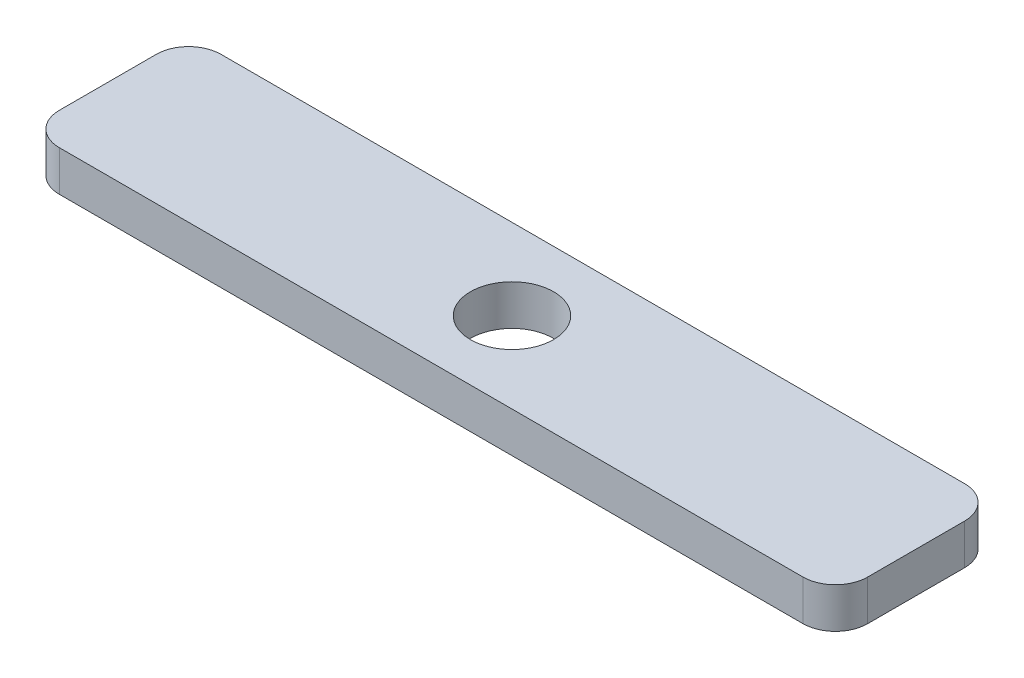
ISO-10303-21;
HEADER;
FILE_DESCRIPTION(('STEP AP214'),'2;1');
FILE_NAME('part.step','',(''),(''),'','','');
FILE_SCHEMA(('AUTOMOTIVE_DESIGN { 1 0 10303 214 1 1 1 1 }'));
ENDSEC;
DATA;
#1=APPLICATION_CONTEXT('core data for automotive mechanical design processes');
#2=APPLICATION_PROTOCOL_DEFINITION('international standard','automotive_design',2000,#1);
#3=PRODUCT_CONTEXT('',#1,'mechanical');
#4=PRODUCT('Part','Part','',(#3));
#5=PRODUCT_RELATED_PRODUCT_CATEGORY('part','',(#4));
#6=PRODUCT_DEFINITION_FORMATION('','',#4);
#7=PRODUCT_DEFINITION_CONTEXT('part definition',#1,'design');
#8=PRODUCT_DEFINITION('design','',#6,#7);
#9=PRODUCT_DEFINITION_SHAPE('','',#8);
#10=(LENGTH_UNIT() NAMED_UNIT(*) SI_UNIT(.MILLI.,.METRE.));
#11=(NAMED_UNIT(*) PLANE_ANGLE_UNIT() SI_UNIT($,.RADIAN.));
#12=(NAMED_UNIT(*) SI_UNIT($,.STERADIAN.) SOLID_ANGLE_UNIT());
#13=UNCERTAINTY_MEASURE_WITH_UNIT(LENGTH_MEASURE(1.E-05),#10,'distance_accuracy_value','');
#14=(GEOMETRIC_REPRESENTATION_CONTEXT(3) GLOBAL_UNCERTAINTY_ASSIGNED_CONTEXT((#13)) GLOBAL_UNIT_ASSIGNED_CONTEXT((#10,
#11,#12)) REPRESENTATION_CONTEXT('',''));
#15=CARTESIAN_POINT('',(0.,0.,0.));
#16=DIRECTION('',(0.,0.,1.));
#17=DIRECTION('',(1.,0.,0.));
#18=AXIS2_PLACEMENT_3D('',#15,#16,#17);
#19=CARTESIAN_POINT('',(0.,3.175,0.));
#20=DIRECTION('',(0.,-1.,0.));
#21=DIRECTION('',(0.,0.,-1.));
#22=AXIS2_PLACEMENT_3D('',#19,#20,#21);
#23=PLANE('',#22);
#24=DIRECTION('',(0.,0.,1.));
#25=VECTOR('',#24,1.);
#26=CARTESIAN_POINT('',(-31.75,3.175,6.35));
#27=LINE('',#26,#25);
#28=CARTESIAN_POINT('',(-31.75,3.175,-3.81));
#29=VERTEX_POINT('',#28);
#30=CARTESIAN_POINT('',(-31.75,3.175,3.81));
#31=VERTEX_POINT('',#30);
#32=EDGE_CURVE('E171',#29,#31,#27,.T.);
#33=ORIENTED_EDGE('',*,*,#32,.T.);
#34=CARTESIAN_POINT('',(-29.21,3.175,3.81));
#35=DIRECTION('',(0.,-1.,0.));
#36=DIRECTION('',(0.,0.,-1.));
#37=AXIS2_PLACEMENT_3D('',#34,#35,#36);
#38=CIRCLE('',#37,2.54);
#39=CARTESIAN_POINT('',(-29.21,3.175,6.35));
#40=VERTEX_POINT('',#39);
#41=EDGE_CURVE('E148',#31,#40,#38,.F.);
#42=ORIENTED_EDGE('',*,*,#41,.T.);
#43=DIRECTION('',(1.,0.,0.));
#44=VECTOR('',#43,1.);
#45=CARTESIAN_POINT('',(-31.75,3.175,6.35));
#46=LINE('',#45,#44);
#47=CARTESIAN_POINT('',(29.21,3.175,6.35));
#48=VERTEX_POINT('',#47);
#49=EDGE_CURVE('E119',#40,#48,#46,.T.);
#50=ORIENTED_EDGE('',*,*,#49,.T.);
#51=CARTESIAN_POINT('',(29.21,3.175,3.81));
#52=DIRECTION('',(0.,-1.,0.));
#53=DIRECTION('',(0.,0.,-1.));
#54=AXIS2_PLACEMENT_3D('',#51,#52,#53);
#55=CIRCLE('',#54,2.54);
#56=CARTESIAN_POINT('',(31.75,3.175,3.81));
#57=VERTEX_POINT('',#56);
#58=EDGE_CURVE('E143',#48,#57,#55,.F.);
#59=ORIENTED_EDGE('',*,*,#58,.T.);
#60=DIRECTION('',(0.,0.,-1.));
#61=VECTOR('',#60,1.);
#62=CARTESIAN_POINT('',(31.75,3.175,6.35));
#63=LINE('',#62,#61);
#64=CARTESIAN_POINT('',(31.75,3.175,-3.81));
#65=VERTEX_POINT('',#64);
#66=EDGE_CURVE('E126',#57,#65,#63,.T.);
#67=ORIENTED_EDGE('',*,*,#66,.T.);
#68=CARTESIAN_POINT('',(29.21,3.175,-3.81));
#69=DIRECTION('',(0.,-1.,0.));
#70=DIRECTION('',(0.,0.,-1.));
#71=AXIS2_PLACEMENT_3D('',#68,#69,#70);
#72=CIRCLE('',#71,2.54);
#73=CARTESIAN_POINT('',(29.21,3.175,-6.35));
#74=VERTEX_POINT('',#73);
#75=EDGE_CURVE('E55',#65,#74,#72,.F.);
#76=ORIENTED_EDGE('',*,*,#75,.T.);
#77=DIRECTION('',(-1.,0.,0.));
#78=VECTOR('',#77,1.);
#79=CARTESIAN_POINT('',(-31.75,3.175,-6.35));
#80=LINE('',#79,#78);
#81=CARTESIAN_POINT('',(-29.21,3.175,-6.35));
#82=VERTEX_POINT('',#81);
#83=EDGE_CURVE('E129',#74,#82,#80,.T.);
#84=ORIENTED_EDGE('',*,*,#83,.T.);
#85=CARTESIAN_POINT('',(-29.21,3.175,-3.81));
#86=DIRECTION('',(0.,-1.,0.));
#87=DIRECTION('',(0.,0.,-1.));
#88=AXIS2_PLACEMENT_3D('',#85,#86,#87);
#89=CIRCLE('',#88,2.54);
#90=EDGE_CURVE('E146',#82,#29,#89,.F.);
#91=ORIENTED_EDGE('',*,*,#90,.T.);
#92=EDGE_LOOP('',(#33,#42,#50,#59,#67,#76,#84,#91));
#93=FACE_BOUND('',#92,.T.);
#94=CARTESIAN_POINT('',(0.,3.175,0.));
#95=DIRECTION('',(0.,1.,0.));
#96=DIRECTION('',(0.,0.,1.));
#97=AXIS2_PLACEMENT_3D('',#94,#95,#96);
#98=CIRCLE('',#97,3.2639);
#99=CARTESIAN_POINT('',(0.,3.175,3.2639));
#100=VERTEX_POINT('',#99);
#101=EDGE_CURVE('E164',#100,#100,#98,.T.);
#102=ORIENTED_EDGE('',*,*,#101,.F.);
#103=EDGE_LOOP('',(#102));
#104=FACE_BOUND('',#103,.T.);
#105=ADVANCED_FACE('F33',(#93,#104),#23,.F.);
#106=CARTESIAN_POINT('',(0.,0.,0.));
#107=DIRECTION('',(0.,-1.,0.));
#108=DIRECTION('',(0.,0.,-1.));
#109=AXIS2_PLACEMENT_3D('',#106,#107,#108);
#110=PLANE('',#109);
#111=DIRECTION('',(1.,0.,0.));
#112=VECTOR('',#111,1.);
#113=CARTESIAN_POINT('',(-31.75,0.,6.35));
#114=LINE('',#113,#112);
#115=CARTESIAN_POINT('',(-29.21,0.,6.35));
#116=VERTEX_POINT('',#115);
#117=CARTESIAN_POINT('',(29.21,0.,6.35));
#118=VERTEX_POINT('',#117);
#119=EDGE_CURVE('E116',#116,#118,#114,.T.);
#120=ORIENTED_EDGE('',*,*,#119,.F.);
#121=CARTESIAN_POINT('',(-29.21,0.,3.81));
#122=DIRECTION('',(0.,-1.,0.));
#123=DIRECTION('',(0.,0.,-1.));
#124=AXIS2_PLACEMENT_3D('',#121,#122,#123);
#125=CIRCLE('',#124,2.54);
#126=CARTESIAN_POINT('',(-31.75,0.,3.81));
#127=VERTEX_POINT('',#126);
#128=EDGE_CURVE('E99',#116,#127,#125,.T.);
#129=ORIENTED_EDGE('',*,*,#128,.T.);
#130=DIRECTION('',(0.,0.,1.));
#131=VECTOR('',#130,1.);
#132=CARTESIAN_POINT('',(-31.75,0.,6.35));
#133=LINE('',#132,#131);
#134=CARTESIAN_POINT('',(-31.75,0.,-3.81));
#135=VERTEX_POINT('',#134);
#136=EDGE_CURVE('E127',#135,#127,#133,.T.);
#137=ORIENTED_EDGE('',*,*,#136,.F.);
#138=CARTESIAN_POINT('',(-29.21,0.,-3.81));
#139=DIRECTION('',(0.,-1.,0.));
#140=DIRECTION('',(0.,0.,-1.));
#141=AXIS2_PLACEMENT_3D('',#138,#139,#140);
#142=CIRCLE('',#141,2.54);
#143=CARTESIAN_POINT('',(-29.21,0.,-6.35));
#144=VERTEX_POINT('',#143);
#145=EDGE_CURVE('E110',#135,#144,#142,.T.);
#146=ORIENTED_EDGE('',*,*,#145,.T.);
#147=DIRECTION('',(-1.,0.,0.));
#148=VECTOR('',#147,1.);
#149=CARTESIAN_POINT('',(-31.75,0.,-6.35));
#150=LINE('',#149,#148);
#151=CARTESIAN_POINT('',(29.21,0.,-6.35));
#152=VERTEX_POINT('',#151);
#153=EDGE_CURVE('E131',#152,#144,#150,.T.);
#154=ORIENTED_EDGE('',*,*,#153,.F.);
#155=CARTESIAN_POINT('',(29.21,0.,-3.81));
#156=DIRECTION('',(0.,-1.,0.));
#157=DIRECTION('',(0.,0.,-1.));
#158=AXIS2_PLACEMENT_3D('',#155,#156,#157);
#159=CIRCLE('',#158,2.54);
#160=CARTESIAN_POINT('',(31.75,0.,-3.81));
#161=VERTEX_POINT('',#160);
#162=EDGE_CURVE('E137',#152,#161,#159,.T.);
#163=ORIENTED_EDGE('',*,*,#162,.T.);
#164=DIRECTION('',(0.,0.,-1.));
#165=VECTOR('',#164,1.);
#166=CARTESIAN_POINT('',(31.75,0.,6.35));
#167=LINE('',#166,#165);
#168=CARTESIAN_POINT('',(31.75,0.,3.81));
#169=VERTEX_POINT('',#168);
#170=EDGE_CURVE('E159',#169,#161,#167,.T.);
#171=ORIENTED_EDGE('',*,*,#170,.F.);
#172=CARTESIAN_POINT('',(29.21,0.,3.81));
#173=DIRECTION('',(0.,-1.,0.));
#174=DIRECTION('',(0.,0.,-1.));
#175=AXIS2_PLACEMENT_3D('',#172,#173,#174);
#176=CIRCLE('',#175,2.54);
#177=EDGE_CURVE('E120',#169,#118,#176,.T.);
#178=ORIENTED_EDGE('',*,*,#177,.T.);
#179=EDGE_LOOP('',(#120,#129,#137,#146,#154,#163,#171,#178));
#180=FACE_BOUND('',#179,.T.);
#181=CARTESIAN_POINT('',(0.,0.,0.));
#182=DIRECTION('',(0.,1.,0.));
#183=DIRECTION('',(0.,0.,1.));
#184=AXIS2_PLACEMENT_3D('',#181,#182,#183);
#185=CIRCLE('',#184,3.2639);
#186=CARTESIAN_POINT('',(0.,0.,3.2639));
#187=VERTEX_POINT('',#186);
#188=EDGE_CURVE('E167',#187,#187,#185,.T.);
#189=ORIENTED_EDGE('',*,*,#188,.T.);
#190=EDGE_LOOP('',(#189));
#191=FACE_BOUND('',#190,.T.);
#192=ADVANCED_FACE('F123',(#180,#191),#110,.T.);
#193=CARTESIAN_POINT('',(31.75,3.175,6.35));
#194=DIRECTION('',(-1.,0.,0.));
#195=DIRECTION('',(0.,0.,1.));
#196=AXIS2_PLACEMENT_3D('',#193,#194,#195);
#197=PLANE('',#196);
#198=ORIENTED_EDGE('',*,*,#170,.T.);
#199=DIRECTION('',(0.,-1.,0.));
#200=VECTOR('',#199,1.);
#201=CARTESIAN_POINT('',(31.75,3.175,-3.81));
#202=LINE('',#201,#200);
#203=EDGE_CURVE('E11',#161,#65,#202,.F.);
#204=ORIENTED_EDGE('',*,*,#203,.T.);
#205=ORIENTED_EDGE('',*,*,#66,.F.);
#206=DIRECTION('',(0.,-1.,0.));
#207=VECTOR('',#206,1.);
#208=CARTESIAN_POINT('',(31.75,3.175,3.81));
#209=LINE('',#208,#207);
#210=EDGE_CURVE('E41',#57,#169,#209,.T.);
#211=ORIENTED_EDGE('',*,*,#210,.T.);
#212=EDGE_LOOP('',(#198,#204,#205,#211));
#213=FACE_BOUND('',#212,.T.);
#214=ADVANCED_FACE('F158',(#213),#197,.F.);
#215=CARTESIAN_POINT('',(-31.75,3.175,-6.35));
#216=DIRECTION('',(0.,0.,1.));
#217=DIRECTION('',(1.,0.,0.));
#218=AXIS2_PLACEMENT_3D('',#215,#216,#217);
#219=PLANE('',#218);
#220=ORIENTED_EDGE('',*,*,#153,.T.);
#221=DIRECTION('',(0.,-1.,0.));
#222=VECTOR('',#221,1.);
#223=CARTESIAN_POINT('',(-29.21,3.175,-6.35));
#224=LINE('',#223,#222);
#225=EDGE_CURVE('E48',#144,#82,#224,.F.);
#226=ORIENTED_EDGE('',*,*,#225,.T.);
#227=ORIENTED_EDGE('',*,*,#83,.F.);
#228=DIRECTION('',(0.,-1.,0.));
#229=VECTOR('',#228,1.);
#230=CARTESIAN_POINT('',(29.21,3.175,-6.35));
#231=LINE('',#230,#229);
#232=EDGE_CURVE('E150',#74,#152,#231,.T.);
#233=ORIENTED_EDGE('',*,*,#232,.T.);
#234=EDGE_LOOP('',(#220,#226,#227,#233));
#235=FACE_BOUND('',#234,.T.);
#236=ADVANCED_FACE('F201',(#235),#219,.F.);
#237=CARTESIAN_POINT('',(-31.75,3.175,6.35));
#238=DIRECTION('',(1.,0.,0.));
#239=DIRECTION('',(0.,0.,-1.));
#240=AXIS2_PLACEMENT_3D('',#237,#238,#239);
#241=PLANE('',#240);
#242=ORIENTED_EDGE('',*,*,#136,.T.);
#243=DIRECTION('',(0.,-1.,0.));
#244=VECTOR('',#243,1.);
#245=CARTESIAN_POINT('',(-31.75,3.175,3.81));
#246=LINE('',#245,#244);
#247=EDGE_CURVE('E104',#127,#31,#246,.F.);
#248=ORIENTED_EDGE('',*,*,#247,.T.);
#249=ORIENTED_EDGE('',*,*,#32,.F.);
#250=DIRECTION('',(0.,-1.,0.));
#251=VECTOR('',#250,1.);
#252=CARTESIAN_POINT('',(-31.75,3.175,-3.81));
#253=LINE('',#252,#251);
#254=EDGE_CURVE('E109',#29,#135,#253,.T.);
#255=ORIENTED_EDGE('',*,*,#254,.T.);
#256=EDGE_LOOP('',(#242,#248,#249,#255));
#257=FACE_BOUND('',#256,.T.);
#258=ADVANCED_FACE('F189',(#257),#241,.F.);
#259=CARTESIAN_POINT('',(-31.75,3.175,6.35));
#260=DIRECTION('',(0.,0.,-1.));
#261=DIRECTION('',(-1.,0.,0.));
#262=AXIS2_PLACEMENT_3D('',#259,#260,#261);
#263=PLANE('',#262);
#264=ORIENTED_EDGE('',*,*,#49,.F.);
#265=DIRECTION('',(0.,-1.,0.));
#266=VECTOR('',#265,1.);
#267=CARTESIAN_POINT('',(-29.21,3.175,6.35));
#268=LINE('',#267,#266);
#269=EDGE_CURVE('E103',#40,#116,#268,.T.);
#270=ORIENTED_EDGE('',*,*,#269,.T.);
#271=ORIENTED_EDGE('',*,*,#119,.T.);
#272=DIRECTION('',(0.,-1.,0.));
#273=VECTOR('',#272,1.);
#274=CARTESIAN_POINT('',(29.21,3.175,6.35));
#275=LINE('',#274,#273);
#276=EDGE_CURVE('E121',#118,#48,#275,.F.);
#277=ORIENTED_EDGE('',*,*,#276,.T.);
#278=EDGE_LOOP('',(#264,#270,#271,#277));
#279=FACE_BOUND('',#278,.T.);
#280=ADVANCED_FACE('F115',(#279),#263,.F.);
#281=CARTESIAN_POINT('',(0.,3.175,0.));
#282=DIRECTION('',(0.,-1.,0.));
#283=DIRECTION('',(0.,0.,-1.));
#284=AXIS2_PLACEMENT_3D('',#281,#282,#283);
#285=CYLINDRICAL_SURFACE('',#284,3.2639);
#286=ORIENTED_EDGE('',*,*,#101,.T.);
#287=EDGE_LOOP('',(#286));
#288=FACE_BOUND('',#287,.T.);
#289=ORIENTED_EDGE('',*,*,#188,.F.);
#290=EDGE_LOOP('',(#289));
#291=FACE_BOUND('',#290,.T.);
#292=ADVANCED_FACE('F178',(#288,#291),#285,.F.);
#293=CARTESIAN_POINT('',(-29.21,3.175,3.81));
#294=DIRECTION('',(0.,-1.,0.));
#295=DIRECTION('',(0.,0.,-1.));
#296=AXIS2_PLACEMENT_3D('',#293,#294,#295);
#297=CYLINDRICAL_SURFACE('',#296,2.54);
#298=ORIENTED_EDGE('',*,*,#41,.F.);
#299=ORIENTED_EDGE('',*,*,#247,.F.);
#300=ORIENTED_EDGE('',*,*,#128,.F.);
#301=ORIENTED_EDGE('',*,*,#269,.F.);
#302=EDGE_LOOP('',(#298,#299,#300,#301));
#303=FACE_BOUND('',#302,.T.);
#304=ADVANCED_FACE('F102',(#303),#297,.T.);
#305=CARTESIAN_POINT('',(-29.21,3.175,-3.81));
#306=DIRECTION('',(0.,-1.,0.));
#307=DIRECTION('',(0.,0.,-1.));
#308=AXIS2_PLACEMENT_3D('',#305,#306,#307);
#309=CYLINDRICAL_SURFACE('',#308,2.54);
#310=ORIENTED_EDGE('',*,*,#90,.F.);
#311=ORIENTED_EDGE('',*,*,#225,.F.);
#312=ORIENTED_EDGE('',*,*,#145,.F.);
#313=ORIENTED_EDGE('',*,*,#254,.F.);
#314=EDGE_LOOP('',(#310,#311,#312,#313));
#315=FACE_BOUND('',#314,.T.);
#316=ADVANCED_FACE('F186',(#315),#309,.T.);
#317=CARTESIAN_POINT('',(29.21,3.175,-3.81));
#318=DIRECTION('',(0.,-1.,0.));
#319=DIRECTION('',(0.,0.,-1.));
#320=AXIS2_PLACEMENT_3D('',#317,#318,#319);
#321=CYLINDRICAL_SURFACE('',#320,2.54);
#322=ORIENTED_EDGE('',*,*,#75,.F.);
#323=ORIENTED_EDGE('',*,*,#203,.F.);
#324=ORIENTED_EDGE('',*,*,#162,.F.);
#325=ORIENTED_EDGE('',*,*,#232,.F.);
#326=EDGE_LOOP('',(#322,#323,#324,#325));
#327=FACE_BOUND('',#326,.T.);
#328=ADVANCED_FACE('F208',(#327),#321,.T.);
#329=CARTESIAN_POINT('',(29.21,3.175,3.81));
#330=DIRECTION('',(0.,-1.,0.));
#331=DIRECTION('',(0.,0.,-1.));
#332=AXIS2_PLACEMENT_3D('',#329,#330,#331);
#333=CYLINDRICAL_SURFACE('',#332,2.54);
#334=ORIENTED_EDGE('',*,*,#58,.F.);
#335=ORIENTED_EDGE('',*,*,#276,.F.);
#336=ORIENTED_EDGE('',*,*,#177,.F.);
#337=ORIENTED_EDGE('',*,*,#210,.F.);
#338=EDGE_LOOP('',(#334,#335,#336,#337));
#339=FACE_BOUND('',#338,.T.);
#340=ADVANCED_FACE('F35',(#339),#333,.T.);
#341=CLOSED_SHELL('',(#105,#192,#214,#236,#258,#280,#292,#304,#316,#328,#340));
#342=MANIFOLD_SOLID_BREP('B2',#341);
#343=ADVANCED_BREP_SHAPE_REPRESENTATION('',(#18,#342),#14);
#344=SHAPE_DEFINITION_REPRESENTATION(#9,#343);
ENDSEC;
END-ISO-10303-21;
